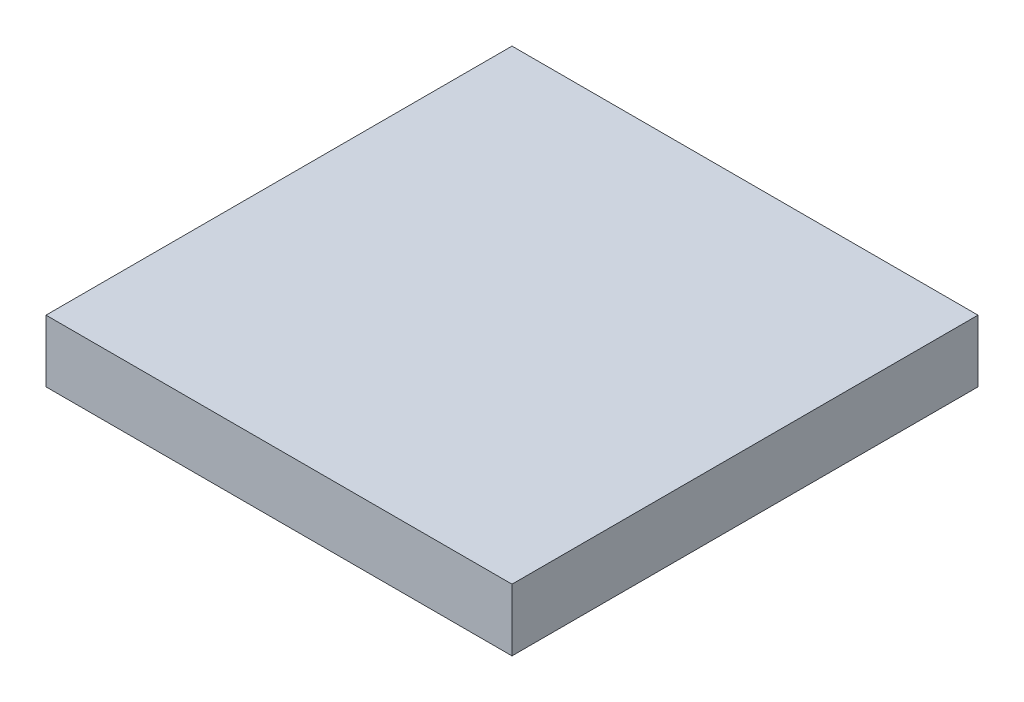
ISO-10303-21;
HEADER;
FILE_DESCRIPTION(('STEP AP214'),'2;1');
FILE_NAME('part.step','',(''),(''),'','','');
FILE_SCHEMA(('AUTOMOTIVE_DESIGN { 1 0 10303 214 1 1 1 1 }'));
ENDSEC;
DATA;
#1=APPLICATION_CONTEXT('core data for automotive mechanical design processes');
#2=APPLICATION_PROTOCOL_DEFINITION('international standard','automotive_design',2000,#1);
#3=PRODUCT_CONTEXT('',#1,'mechanical');
#4=PRODUCT('Part','Part','',(#3));
#5=PRODUCT_RELATED_PRODUCT_CATEGORY('part','',(#4));
#6=PRODUCT_DEFINITION_FORMATION('','',#4);
#7=PRODUCT_DEFINITION_CONTEXT('part definition',#1,'design');
#8=PRODUCT_DEFINITION('design','',#6,#7);
#9=PRODUCT_DEFINITION_SHAPE('','',#8);
#10=(LENGTH_UNIT() NAMED_UNIT(*) SI_UNIT(.MILLI.,.METRE.));
#11=(NAMED_UNIT(*) PLANE_ANGLE_UNIT() SI_UNIT($,.RADIAN.));
#12=(NAMED_UNIT(*) SI_UNIT($,.STERADIAN.) SOLID_ANGLE_UNIT());
#13=UNCERTAINTY_MEASURE_WITH_UNIT(LENGTH_MEASURE(1.E-05),#10,'distance_accuracy_value','');
#14=(GEOMETRIC_REPRESENTATION_CONTEXT(3) GLOBAL_UNCERTAINTY_ASSIGNED_CONTEXT((#13)) GLOBAL_UNIT_ASSIGNED_CONTEXT((#10,
#11,#12)) REPRESENTATION_CONTEXT('',''));
#15=CARTESIAN_POINT('',(0.,0.,0.));
#16=DIRECTION('',(0.,0.,1.));
#17=DIRECTION('',(1.,0.,0.));
#18=AXIS2_PLACEMENT_3D('',#15,#16,#17);
#19=CARTESIAN_POINT('',(7.39237081195294,2.,-7.41929171471637));
#20=DIRECTION('',(-1.,0.,0.));
#21=DIRECTION('',(0.,0.,1.));
#22=AXIS2_PLACEMENT_3D('',#19,#20,#21);
#23=PLANE('',#22);
#24=DIRECTION('',(0.,0.,-1.));
#25=VECTOR('',#24,1.);
#26=CARTESIAN_POINT('',(7.39237081195294,0.,-7.41929171471637));
#27=LINE('',#26,#25);
#28=CARTESIAN_POINT('',(7.39237081195295,0.,7.58070828528363));
#29=VERTEX_POINT('',#28);
#30=CARTESIAN_POINT('',(7.39237081195294,0.,-7.41929171471637));
#31=VERTEX_POINT('',#30);
#32=EDGE_CURVE('E182',#29,#31,#27,.T.);
#33=ORIENTED_EDGE('',*,*,#32,.T.);
#34=DIRECTION('',(0.,-1.,0.));
#35=VECTOR('',#34,1.);
#36=CARTESIAN_POINT('',(7.39237081195294,2.,-7.41929171471637));
#37=LINE('',#36,#35);
#38=CARTESIAN_POINT('',(7.39237081195294,2.,-7.41929171471637));
#39=VERTEX_POINT('',#38);
#40=EDGE_CURVE('E11',#39,#31,#37,.T.);
#41=ORIENTED_EDGE('',*,*,#40,.F.);
#42=DIRECTION('',(0.,0.,-1.));
#43=VECTOR('',#42,1.);
#44=CARTESIAN_POINT('',(7.39237081195294,2.,-7.41929171471637));
#45=LINE('',#44,#43);
#46=CARTESIAN_POINT('',(7.39237081195295,2.,7.58070828528363));
#47=VERTEX_POINT('',#46);
#48=EDGE_CURVE('E229',#47,#39,#45,.T.);
#49=ORIENTED_EDGE('',*,*,#48,.F.);
#50=DIRECTION('',(0.,-1.,0.));
#51=VECTOR('',#50,1.);
#52=CARTESIAN_POINT('',(7.39237081195295,2.,7.58070828528363));
#53=LINE('',#52,#51);
#54=EDGE_CURVE('E243',#47,#29,#53,.T.);
#55=ORIENTED_EDGE('',*,*,#54,.T.);
#56=EDGE_LOOP('',(#33,#41,#49,#55));
#57=FACE_BOUND('',#56,.T.);
#58=ADVANCED_FACE('F45',(#57),#23,.F.);
#59=CARTESIAN_POINT('',(-7.60762918804705,2.,-7.41929171471637));
#60=DIRECTION('',(0.,0.,1.));
#61=DIRECTION('',(1.,0.,0.));
#62=AXIS2_PLACEMENT_3D('',#59,#60,#61);
#63=PLANE('',#62);
#64=DIRECTION('',(-1.,0.,0.));
#65=VECTOR('',#64,1.);
#66=CARTESIAN_POINT('',(-7.60762918804705,0.,-7.41929171471637));
#67=LINE('',#66,#65);
#68=CARTESIAN_POINT('',(-7.60762918804705,0.,-7.41929171471637));
#69=VERTEX_POINT('',#68);
#70=EDGE_CURVE('E247',#31,#69,#67,.T.);
#71=ORIENTED_EDGE('',*,*,#70,.T.);
#72=DIRECTION('',(0.,-1.,0.));
#73=VECTOR('',#72,1.);
#74=CARTESIAN_POINT('',(-7.60762918804705,2.,-7.41929171471637));
#75=LINE('',#74,#73);
#76=CARTESIAN_POINT('',(-7.60762918804705,2.,-7.41929171471637));
#77=VERTEX_POINT('',#76);
#78=EDGE_CURVE('E53',#77,#69,#75,.T.);
#79=ORIENTED_EDGE('',*,*,#78,.F.);
#80=DIRECTION('',(-1.,0.,0.));
#81=VECTOR('',#80,1.);
#82=CARTESIAN_POINT('',(-7.60762918804705,2.,-7.41929171471637));
#83=LINE('',#82,#81);
#84=EDGE_CURVE('E233',#39,#77,#83,.T.);
#85=ORIENTED_EDGE('',*,*,#84,.F.);
#86=ORIENTED_EDGE('',*,*,#40,.T.);
#87=EDGE_LOOP('',(#71,#79,#85,#86));
#88=FACE_BOUND('',#87,.T.);
#89=ADVANCED_FACE('F283',(#88),#63,.F.);
#90=CARTESIAN_POINT('',(-7.60762918804705,2.,-7.41929171471637));
#91=DIRECTION('',(1.,0.,0.));
#92=DIRECTION('',(0.,0.,-1.));
#93=AXIS2_PLACEMENT_3D('',#90,#91,#92);
#94=PLANE('',#93);
#95=DIRECTION('',(0.,0.,1.));
#96=VECTOR('',#95,1.);
#97=CARTESIAN_POINT('',(-7.60762918804705,0.,-7.41929171471637));
#98=LINE('',#97,#96);
#99=CARTESIAN_POINT('',(-7.60762918804705,0.,7.58070828528363));
#100=VERTEX_POINT('',#99);
#101=EDGE_CURVE('E250',#69,#100,#98,.T.);
#102=ORIENTED_EDGE('',*,*,#101,.T.);
#103=DIRECTION('',(0.,-1.,0.));
#104=VECTOR('',#103,1.);
#105=CARTESIAN_POINT('',(-7.60762918804705,2.,7.58070828528363));
#106=LINE('',#105,#104);
#107=CARTESIAN_POINT('',(-7.60762918804705,2.,7.58070828528363));
#108=VERTEX_POINT('',#107);
#109=EDGE_CURVE('E258',#108,#100,#106,.T.);
#110=ORIENTED_EDGE('',*,*,#109,.F.);
#111=DIRECTION('',(0.,0.,1.));
#112=VECTOR('',#111,1.);
#113=CARTESIAN_POINT('',(-7.60762918804705,2.,-7.41929171471637));
#114=LINE('',#113,#112);
#115=EDGE_CURVE('E237',#77,#108,#114,.T.);
#116=ORIENTED_EDGE('',*,*,#115,.F.);
#117=ORIENTED_EDGE('',*,*,#78,.T.);
#118=EDGE_LOOP('',(#102,#110,#116,#117));
#119=FACE_BOUND('',#118,.T.);
#120=ADVANCED_FACE('F267',(#119),#94,.F.);
#121=CARTESIAN_POINT('',(-7.60762918804705,2.,7.58070828528363));
#122=DIRECTION('',(0.,0.,-1.));
#123=DIRECTION('',(-1.,0.,0.));
#124=AXIS2_PLACEMENT_3D('',#121,#122,#123);
#125=PLANE('',#124);
#126=DIRECTION('',(1.,0.,0.));
#127=VECTOR('',#126,1.);
#128=CARTESIAN_POINT('',(-7.60762918804705,0.,7.58070828528363));
#129=LINE('',#128,#127);
#130=EDGE_CURVE('E234',#100,#29,#129,.T.);
#131=ORIENTED_EDGE('',*,*,#130,.T.);
#132=ORIENTED_EDGE('',*,*,#54,.F.);
#133=DIRECTION('',(1.,0.,0.));
#134=VECTOR('',#133,1.);
#135=CARTESIAN_POINT('',(-7.60762918804705,2.,7.58070828528363));
#136=LINE('',#135,#134);
#137=EDGE_CURVE('E240',#108,#47,#136,.T.);
#138=ORIENTED_EDGE('',*,*,#137,.F.);
#139=ORIENTED_EDGE('',*,*,#109,.T.);
#140=EDGE_LOOP('',(#131,#132,#138,#139));
#141=FACE_BOUND('',#140,.T.);
#142=ADVANCED_FACE('F276',(#141),#125,.F.);
#143=CARTESIAN_POINT('',(0.,2.,0.));
#144=DIRECTION('',(0.,1.,0.));
#145=DIRECTION('',(0.,0.,1.));
#146=AXIS2_PLACEMENT_3D('',#143,#144,#145);
#147=PLANE('',#146);
#148=ORIENTED_EDGE('',*,*,#48,.T.);
#149=ORIENTED_EDGE('',*,*,#84,.T.);
#150=ORIENTED_EDGE('',*,*,#115,.T.);
#151=ORIENTED_EDGE('',*,*,#137,.T.);
#152=EDGE_LOOP('',(#148,#149,#150,#151));
#153=FACE_BOUND('',#152,.T.);
#154=ADVANCED_FACE('F282',(#153),#147,.T.);
#155=CARTESIAN_POINT('',(0.,0.,0.));
#156=DIRECTION('',(0.,1.,0.));
#157=DIRECTION('',(0.,0.,1.));
#158=AXIS2_PLACEMENT_3D('',#155,#156,#157);
#159=PLANE('',#158);
#160=DIRECTION('',(-1.,0.,0.));
#161=VECTOR('',#160,1.);
#162=CARTESIAN_POINT('',(4.19237081195295,0.,-1.41929171471637));
#163=LINE('',#162,#161);
#164=CARTESIAN_POINT('',(4.19237081195295,0.,-1.41929171471637));
#165=VERTEX_POINT('',#164);
#166=CARTESIAN_POINT('',(2.59237081195295,0.,-1.41929171471637));
#167=VERTEX_POINT('',#166);
#168=EDGE_CURVE('E162',#165,#167,#163,.T.);
#169=ORIENTED_EDGE('',*,*,#168,.T.);
#170=DIRECTION('',(0.,0.,1.));
#171=VECTOR('',#170,1.);
#172=CARTESIAN_POINT('',(2.59237081195295,0.,-1.41929171471637));
#173=LINE('',#172,#171);
#174=CARTESIAN_POINT('',(2.59237081195295,0.,1.58070828528363));
#175=VERTEX_POINT('',#174);
#176=EDGE_CURVE('E172',#167,#175,#173,.T.);
#177=ORIENTED_EDGE('',*,*,#176,.T.);
#178=DIRECTION('',(1.,0.,0.));
#179=VECTOR('',#178,1.);
#180=CARTESIAN_POINT('',(4.19237081195295,0.,1.58070828528363));
#181=LINE('',#180,#179);
#182=CARTESIAN_POINT('',(4.19237081195295,0.,1.58070828528363));
#183=VERTEX_POINT('',#182);
#184=EDGE_CURVE('E139',#175,#183,#181,.T.);
#185=ORIENTED_EDGE('',*,*,#184,.T.);
#186=DIRECTION('',(0.,0.,-1.));
#187=VECTOR('',#186,1.);
#188=CARTESIAN_POINT('',(4.19237081195295,0.,-1.41929171471637));
#189=LINE('',#188,#187);
#190=EDGE_CURVE('E60',#183,#165,#189,.T.);
#191=ORIENTED_EDGE('',*,*,#190,.T.);
#192=EDGE_LOOP('',(#169,#177,#185,#191));
#193=FACE_BOUND('',#192,.T.);
#194=DIRECTION('',(-1.,0.,0.));
#195=VECTOR('',#194,1.);
#196=CARTESIAN_POINT('',(-2.80762918804705,0.,-1.41929171471637));
#197=LINE('',#196,#195);
#198=CARTESIAN_POINT('',(-2.80762918804705,0.,-1.41929171471637));
#199=VERTEX_POINT('',#198);
#200=CARTESIAN_POINT('',(-4.40762918804705,0.,-1.41929171471637));
#201=VERTEX_POINT('',#200);
#202=EDGE_CURVE('E201',#199,#201,#197,.T.);
#203=ORIENTED_EDGE('',*,*,#202,.T.);
#204=DIRECTION('',(0.,0.,1.));
#205=VECTOR('',#204,1.);
#206=CARTESIAN_POINT('',(-4.40762918804705,0.,-1.41929171471637));
#207=LINE('',#206,#205);
#208=CARTESIAN_POINT('',(-4.40762918804705,0.,1.58070828528363));
#209=VERTEX_POINT('',#208);
#210=EDGE_CURVE('E175',#201,#209,#207,.T.);
#211=ORIENTED_EDGE('',*,*,#210,.T.);
#212=DIRECTION('',(1.,0.,0.));
#213=VECTOR('',#212,1.);
#214=CARTESIAN_POINT('',(-2.80762918804705,0.,1.58070828528363));
#215=LINE('',#214,#213);
#216=CARTESIAN_POINT('',(-2.80762918804705,0.,1.58070828528363));
#217=VERTEX_POINT('',#216);
#218=EDGE_CURVE('E208',#209,#217,#215,.T.);
#219=ORIENTED_EDGE('',*,*,#218,.T.);
#220=DIRECTION('',(0.,0.,-1.));
#221=VECTOR('',#220,1.);
#222=CARTESIAN_POINT('',(-2.80762918804705,0.,-1.41929171471637));
#223=LINE('',#222,#221);
#224=EDGE_CURVE('E68',#217,#199,#223,.T.);
#225=ORIENTED_EDGE('',*,*,#224,.T.);
#226=EDGE_LOOP('',(#203,#211,#219,#225));
#227=FACE_BOUND('',#226,.T.);
#228=ORIENTED_EDGE('',*,*,#32,.F.);
#229=ORIENTED_EDGE('',*,*,#130,.F.);
#230=ORIENTED_EDGE('',*,*,#101,.F.);
#231=ORIENTED_EDGE('',*,*,#70,.F.);
#232=EDGE_LOOP('',(#228,#229,#230,#231));
#233=FACE_BOUND('',#232,.T.);
#234=ADVANCED_FACE('F273',(#193,#227,#233),#159,.F.);
#235=CARTESIAN_POINT('',(-4.40762918804705,-2.,-1.41929171471637));
#236=DIRECTION('',(-1.,0.,0.));
#237=DIRECTION('',(0.,0.,1.));
#238=AXIS2_PLACEMENT_3D('',#235,#236,#237);
#239=PLANE('',#238);
#240=ORIENTED_EDGE('',*,*,#210,.F.);
#241=DIRECTION('',(0.,1.,0.));
#242=VECTOR('',#241,1.);
#243=CARTESIAN_POINT('',(-4.40762918804705,-2.,-1.41929171471637));
#244=LINE('',#243,#242);
#245=CARTESIAN_POINT('',(-4.40762918804705,-2.,-1.41929171471637));
#246=VERTEX_POINT('',#245);
#247=EDGE_CURVE('E198',#246,#201,#244,.T.);
#248=ORIENTED_EDGE('',*,*,#247,.F.);
#249=DIRECTION('',(0.,0.,1.));
#250=VECTOR('',#249,1.);
#251=CARTESIAN_POINT('',(-4.40762918804705,-2.,-1.41929171471637));
#252=LINE('',#251,#250);
#253=CARTESIAN_POINT('',(-4.40762918804705,-2.,1.58070828528363));
#254=VERTEX_POINT('',#253);
#255=EDGE_CURVE('E205',#246,#254,#252,.T.);
#256=ORIENTED_EDGE('',*,*,#255,.T.);
#257=DIRECTION('',(0.,1.,0.));
#258=VECTOR('',#257,1.);
#259=CARTESIAN_POINT('',(-4.40762918804705,-2.,1.58070828528363));
#260=LINE('',#259,#258);
#261=EDGE_CURVE('E188',#254,#209,#260,.T.);
#262=ORIENTED_EDGE('',*,*,#261,.T.);
#263=EDGE_LOOP('',(#240,#248,#256,#262));
#264=FACE_BOUND('',#263,.T.);
#265=ADVANCED_FACE('F295',(#264),#239,.T.);
#266=CARTESIAN_POINT('',(-2.80762918804705,-2.,-1.41929171471637));
#267=DIRECTION('',(0.,0.,-1.));
#268=DIRECTION('',(-1.,0.,0.));
#269=AXIS2_PLACEMENT_3D('',#266,#267,#268);
#270=PLANE('',#269);
#271=ORIENTED_EDGE('',*,*,#202,.F.);
#272=DIRECTION('',(0.,1.,0.));
#273=VECTOR('',#272,1.);
#274=CARTESIAN_POINT('',(-2.80762918804705,-2.,-1.41929171471637));
#275=LINE('',#274,#273);
#276=CARTESIAN_POINT('',(-2.80762918804705,-2.,-1.41929171471637));
#277=VERTEX_POINT('',#276);
#278=EDGE_CURVE('E195',#277,#199,#275,.T.);
#279=ORIENTED_EDGE('',*,*,#278,.F.);
#280=DIRECTION('',(-1.,0.,0.));
#281=VECTOR('',#280,1.);
#282=CARTESIAN_POINT('',(-2.80762918804705,-2.,-1.41929171471637));
#283=LINE('',#282,#281);
#284=EDGE_CURVE('E191',#277,#246,#283,.T.);
#285=ORIENTED_EDGE('',*,*,#284,.T.);
#286=ORIENTED_EDGE('',*,*,#247,.T.);
#287=EDGE_LOOP('',(#271,#279,#285,#286));
#288=FACE_BOUND('',#287,.T.);
#289=ADVANCED_FACE('F304',(#288),#270,.T.);
#290=CARTESIAN_POINT('',(-2.80762918804705,-2.,-1.41929171471637));
#291=DIRECTION('',(1.,0.,0.));
#292=DIRECTION('',(0.,0.,-1.));
#293=AXIS2_PLACEMENT_3D('',#290,#291,#292);
#294=PLANE('',#293);
#295=ORIENTED_EDGE('',*,*,#224,.F.);
#296=DIRECTION('',(0.,1.,0.));
#297=VECTOR('',#296,1.);
#298=CARTESIAN_POINT('',(-2.80762918804705,-2.,1.58070828528363));
#299=LINE('',#298,#297);
#300=CARTESIAN_POINT('',(-2.80762918804705,-2.,1.58070828528363));
#301=VERTEX_POINT('',#300);
#302=EDGE_CURVE('E192',#301,#217,#299,.T.);
#303=ORIENTED_EDGE('',*,*,#302,.F.);
#304=DIRECTION('',(0.,0.,-1.));
#305=VECTOR('',#304,1.);
#306=CARTESIAN_POINT('',(-2.80762918804705,-2.,-1.41929171471637));
#307=LINE('',#306,#305);
#308=EDGE_CURVE('E218',#301,#277,#307,.T.);
#309=ORIENTED_EDGE('',*,*,#308,.T.);
#310=ORIENTED_EDGE('',*,*,#278,.T.);
#311=EDGE_LOOP('',(#295,#303,#309,#310));
#312=FACE_BOUND('',#311,.T.);
#313=ADVANCED_FACE('F307',(#312),#294,.T.);
#314=CARTESIAN_POINT('',(-2.80762918804705,-2.,1.58070828528363));
#315=DIRECTION('',(0.,0.,1.));
#316=DIRECTION('',(1.,0.,0.));
#317=AXIS2_PLACEMENT_3D('',#314,#315,#316);
#318=PLANE('',#317);
#319=ORIENTED_EDGE('',*,*,#218,.F.);
#320=ORIENTED_EDGE('',*,*,#261,.F.);
#321=DIRECTION('',(1.,0.,0.));
#322=VECTOR('',#321,1.);
#323=CARTESIAN_POINT('',(-2.80762918804705,-2.,1.58070828528363));
#324=LINE('',#323,#322);
#325=EDGE_CURVE('E222',#254,#301,#324,.T.);
#326=ORIENTED_EDGE('',*,*,#325,.T.);
#327=ORIENTED_EDGE('',*,*,#302,.T.);
#328=EDGE_LOOP('',(#319,#320,#326,#327));
#329=FACE_BOUND('',#328,.T.);
#330=ADVANCED_FACE('F302',(#329),#318,.T.);
#331=CARTESIAN_POINT('',(0.,-2.,0.));
#332=DIRECTION('',(0.,-1.,0.));
#333=DIRECTION('',(0.,0.,-1.));
#334=AXIS2_PLACEMENT_3D('',#331,#332,#333);
#335=PLANE('',#334);
#336=ORIENTED_EDGE('',*,*,#255,.F.);
#337=ORIENTED_EDGE('',*,*,#284,.F.);
#338=ORIENTED_EDGE('',*,*,#308,.F.);
#339=ORIENTED_EDGE('',*,*,#325,.F.);
#340=EDGE_LOOP('',(#336,#337,#338,#339));
#341=FACE_BOUND('',#340,.T.);
#342=ADVANCED_FACE('F299',(#341),#335,.T.);
#343=CARTESIAN_POINT('',(2.59237081195295,-2.,-1.41929171471637));
#344=DIRECTION('',(-1.,0.,0.));
#345=DIRECTION('',(0.,0.,1.));
#346=AXIS2_PLACEMENT_3D('',#343,#344,#345);
#347=PLANE('',#346);
#348=ORIENTED_EDGE('',*,*,#176,.F.);
#349=DIRECTION('',(0.,1.,0.));
#350=VECTOR('',#349,1.);
#351=CARTESIAN_POINT('',(2.59237081195295,-2.,-1.41929171471637));
#352=LINE('',#351,#350);
#353=CARTESIAN_POINT('',(2.59237081195295,-2.,-1.41929171471637));
#354=VERTEX_POINT('',#353);
#355=EDGE_CURVE('E160',#354,#167,#352,.T.);
#356=ORIENTED_EDGE('',*,*,#355,.F.);
#357=DIRECTION('',(0.,0.,1.));
#358=VECTOR('',#357,1.);
#359=CARTESIAN_POINT('',(2.59237081195295,-2.,-1.41929171471637));
#360=LINE('',#359,#358);
#361=CARTESIAN_POINT('',(2.59237081195295,-2.,1.58070828528363));
#362=VERTEX_POINT('',#361);
#363=EDGE_CURVE('E153',#354,#362,#360,.T.);
#364=ORIENTED_EDGE('',*,*,#363,.T.);
#365=DIRECTION('',(0.,1.,0.));
#366=VECTOR('',#365,1.);
#367=CARTESIAN_POINT('',(2.59237081195295,-2.,1.58070828528363));
#368=LINE('',#367,#366);
#369=EDGE_CURVE('E134',#362,#175,#368,.T.);
#370=ORIENTED_EDGE('',*,*,#369,.T.);
#371=EDGE_LOOP('',(#348,#356,#364,#370));
#372=FACE_BOUND('',#371,.T.);
#373=ADVANCED_FACE('F159',(#372),#347,.T.);
#374=CARTESIAN_POINT('',(4.19237081195295,-2.,-1.41929171471637));
#375=DIRECTION('',(0.,0.,-1.));
#376=DIRECTION('',(-1.,0.,0.));
#377=AXIS2_PLACEMENT_3D('',#374,#375,#376);
#378=PLANE('',#377);
#379=ORIENTED_EDGE('',*,*,#168,.F.);
#380=DIRECTION('',(0.,1.,0.));
#381=VECTOR('',#380,1.);
#382=CARTESIAN_POINT('',(4.19237081195295,-2.,-1.41929171471637));
#383=LINE('',#382,#381);
#384=CARTESIAN_POINT('',(4.19237081195295,-2.,-1.41929171471637));
#385=VERTEX_POINT('',#384);
#386=EDGE_CURVE('E183',#385,#165,#383,.T.);
#387=ORIENTED_EDGE('',*,*,#386,.F.);
#388=DIRECTION('',(-1.,0.,0.));
#389=VECTOR('',#388,1.);
#390=CARTESIAN_POINT('',(4.19237081195295,-2.,-1.41929171471637));
#391=LINE('',#390,#389);
#392=EDGE_CURVE('E146',#385,#354,#391,.T.);
#393=ORIENTED_EDGE('',*,*,#392,.T.);
#394=ORIENTED_EDGE('',*,*,#355,.T.);
#395=EDGE_LOOP('',(#379,#387,#393,#394));
#396=FACE_BOUND('',#395,.T.);
#397=ADVANCED_FACE('F319',(#396),#378,.T.);
#398=CARTESIAN_POINT('',(4.19237081195295,-2.,-1.41929171471637));
#399=DIRECTION('',(1.,0.,0.));
#400=DIRECTION('',(0.,0.,-1.));
#401=AXIS2_PLACEMENT_3D('',#398,#399,#400);
#402=PLANE('',#401);
#403=ORIENTED_EDGE('',*,*,#190,.F.);
#404=DIRECTION('',(0.,1.,0.));
#405=VECTOR('',#404,1.);
#406=CARTESIAN_POINT('',(4.19237081195295,-2.,1.58070828528363));
#407=LINE('',#406,#405);
#408=CARTESIAN_POINT('',(4.19237081195295,-2.,1.58070828528363));
#409=VERTEX_POINT('',#408);
#410=EDGE_CURVE('E145',#409,#183,#407,.T.);
#411=ORIENTED_EDGE('',*,*,#410,.F.);
#412=DIRECTION('',(0.,0.,-1.));
#413=VECTOR('',#412,1.);
#414=CARTESIAN_POINT('',(4.19237081195295,-2.,-1.41929171471637));
#415=LINE('',#414,#413);
#416=EDGE_CURVE('E156',#409,#385,#415,.T.);
#417=ORIENTED_EDGE('',*,*,#416,.T.);
#418=ORIENTED_EDGE('',*,*,#386,.T.);
#419=EDGE_LOOP('',(#403,#411,#417,#418));
#420=FACE_BOUND('',#419,.T.);
#421=ADVANCED_FACE('F322',(#420),#402,.T.);
#422=CARTESIAN_POINT('',(4.19237081195295,-2.,1.58070828528363));
#423=DIRECTION('',(0.,0.,1.));
#424=DIRECTION('',(1.,0.,0.));
#425=AXIS2_PLACEMENT_3D('',#422,#423,#424);
#426=PLANE('',#425);
#427=ORIENTED_EDGE('',*,*,#184,.F.);
#428=ORIENTED_EDGE('',*,*,#369,.F.);
#429=DIRECTION('',(1.,0.,0.));
#430=VECTOR('',#429,1.);
#431=CARTESIAN_POINT('',(4.19237081195295,-2.,1.58070828528363));
#432=LINE('',#431,#430);
#433=EDGE_CURVE('E137',#362,#409,#432,.T.);
#434=ORIENTED_EDGE('',*,*,#433,.T.);
#435=ORIENTED_EDGE('',*,*,#410,.T.);
#436=EDGE_LOOP('',(#427,#428,#434,#435));
#437=FACE_BOUND('',#436,.T.);
#438=ADVANCED_FACE('F136',(#437),#426,.T.);
#439=CARTESIAN_POINT('',(0.,-2.,0.));
#440=DIRECTION('',(0.,-1.,0.));
#441=DIRECTION('',(0.,0.,-1.));
#442=AXIS2_PLACEMENT_3D('',#439,#440,#441);
#443=PLANE('',#442);
#444=ORIENTED_EDGE('',*,*,#363,.F.);
#445=ORIENTED_EDGE('',*,*,#392,.F.);
#446=ORIENTED_EDGE('',*,*,#416,.F.);
#447=ORIENTED_EDGE('',*,*,#433,.F.);
#448=EDGE_LOOP('',(#444,#445,#446,#447));
#449=FACE_BOUND('',#448,.T.);
#450=ADVANCED_FACE('F151',(#449),#443,.T.);
#451=CLOSED_SHELL('',(#58,#89,#120,#142,#154,#234,#265,#289,#313,#330,#342,#373,#397,#421,#438,#450));
#452=MANIFOLD_SOLID_BREP('B2',#451);
#453=ADVANCED_BREP_SHAPE_REPRESENTATION('',(#18,#452),#14);
#454=SHAPE_DEFINITION_REPRESENTATION(#9,#453);
ENDSEC;
END-ISO-10303-21;
